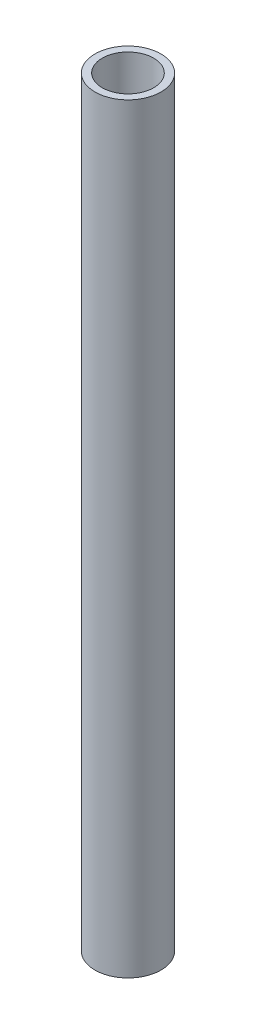
ISO-10303-21;
HEADER;
FILE_DESCRIPTION(('STEP AP214'),'2;1');
FILE_NAME('part.step','',(''),(''),'','','');
FILE_SCHEMA(('AUTOMOTIVE_DESIGN { 1 0 10303 214 1 1 1 1 }'));
ENDSEC;
DATA;
#1=APPLICATION_CONTEXT('core data for automotive mechanical design processes');
#2=APPLICATION_PROTOCOL_DEFINITION('international standard','automotive_design',2000,#1);
#3=PRODUCT_CONTEXT('',#1,'mechanical');
#4=PRODUCT('Part','Part','',(#3));
#5=PRODUCT_RELATED_PRODUCT_CATEGORY('part','',(#4));
#6=PRODUCT_DEFINITION_FORMATION('','',#4);
#7=PRODUCT_DEFINITION_CONTEXT('part definition',#1,'design');
#8=PRODUCT_DEFINITION('design','',#6,#7);
#9=PRODUCT_DEFINITION_SHAPE('','',#8);
#10=(LENGTH_UNIT() NAMED_UNIT(*) SI_UNIT(.MILLI.,.METRE.));
#11=(NAMED_UNIT(*) PLANE_ANGLE_UNIT() SI_UNIT($,.RADIAN.));
#12=(NAMED_UNIT(*) SI_UNIT($,.STERADIAN.) SOLID_ANGLE_UNIT());
#13=UNCERTAINTY_MEASURE_WITH_UNIT(LENGTH_MEASURE(1.E-05),#10,'distance_accuracy_value','');
#14=(GEOMETRIC_REPRESENTATION_CONTEXT(3) GLOBAL_UNCERTAINTY_ASSIGNED_CONTEXT((#13)) GLOBAL_UNIT_ASSIGNED_CONTEXT((#10,
#11,#12)) REPRESENTATION_CONTEXT('',''));
#15=CARTESIAN_POINT('',(0.,0.,0.));
#16=DIRECTION('',(0.,0.,1.));
#17=DIRECTION('',(1.,0.,0.));
#18=AXIS2_PLACEMENT_3D('',#15,#16,#17);
#19=CARTESIAN_POINT('',(0.,250.,0.));
#20=DIRECTION('',(0.,1.,0.));
#21=DIRECTION('',(0.,0.,0.999999999999999));
#22=AXIS2_PLACEMENT_3D('',#19,#20,#21);
#23=PLANE('',#22);
#24=CARTESIAN_POINT('',(0.,250.,0.));
#25=DIRECTION('',(0.,1.,0.));
#26=DIRECTION('',(0.,0.,0.999999999999999));
#27=AXIS2_PLACEMENT_3D('',#24,#25,#26);
#28=CIRCLE('',#27,10.85);
#29=CARTESIAN_POINT('',(0.,250.,10.85));
#30=VERTEX_POINT('',#29);
#31=EDGE_CURVE('E12',#30,#30,#28,.T.);
#32=ORIENTED_EDGE('',*,*,#31,.T.);
#33=EDGE_LOOP('',(#32));
#34=FACE_BOUND('',#33,.T.);
#35=CARTESIAN_POINT('',(0.,250.,0.));
#36=DIRECTION('',(0.,1.,0.));
#37=DIRECTION('',(0.,0.,0.999999999999999));
#38=AXIS2_PLACEMENT_3D('',#35,#36,#37);
#39=CIRCLE('',#38,8.45);
#40=CARTESIAN_POINT('',(0.,250.,8.44999999999999));
#41=VERTEX_POINT('',#40);
#42=EDGE_CURVE('E56',#41,#41,#39,.T.);
#43=ORIENTED_EDGE('',*,*,#42,.F.);
#44=EDGE_LOOP('',(#43));
#45=FACE_BOUND('',#44,.T.);
#46=ADVANCED_FACE('F42',(#34,#45),#23,.T.);
#47=CARTESIAN_POINT('',(0.,0.,0.));
#48=DIRECTION('',(0.,1.,0.));
#49=DIRECTION('',(0.,0.,0.999999999999999));
#50=AXIS2_PLACEMENT_3D('',#47,#48,#49);
#51=PLANE('',#50);
#52=CARTESIAN_POINT('',(0.,0.,0.));
#53=DIRECTION('',(0.,1.,0.));
#54=DIRECTION('',(0.,0.,0.999999999999999));
#55=AXIS2_PLACEMENT_3D('',#52,#53,#54);
#56=CIRCLE('',#55,10.85);
#57=CARTESIAN_POINT('',(0.,0.,10.85));
#58=VERTEX_POINT('',#57);
#59=EDGE_CURVE('E46',#58,#58,#56,.T.);
#60=ORIENTED_EDGE('',*,*,#59,.F.);
#61=EDGE_LOOP('',(#60));
#62=FACE_BOUND('',#61,.T.);
#63=CARTESIAN_POINT('',(0.,0.,0.));
#64=DIRECTION('',(0.,1.,0.));
#65=DIRECTION('',(0.,0.,0.999999999999999));
#66=AXIS2_PLACEMENT_3D('',#63,#64,#65);
#67=CIRCLE('',#66,8.45);
#68=CARTESIAN_POINT('',(0.,0.,8.44999999999999));
#69=VERTEX_POINT('',#68);
#70=EDGE_CURVE('E58',#69,#69,#67,.T.);
#71=ORIENTED_EDGE('',*,*,#70,.T.);
#72=EDGE_LOOP('',(#71));
#73=FACE_BOUND('',#72,.T.);
#74=ADVANCED_FACE('F71',(#62,#73),#51,.F.);
#75=CARTESIAN_POINT('',(0.,250.,0.));
#76=DIRECTION('',(0.,-1.,0.));
#77=DIRECTION('',(0.,0.,-0.999999999999999));
#78=AXIS2_PLACEMENT_3D('',#75,#76,#77);
#79=CYLINDRICAL_SURFACE('',#78,10.85);
#80=ORIENTED_EDGE('',*,*,#31,.F.);
#81=EDGE_LOOP('',(#80));
#82=FACE_BOUND('',#81,.T.);
#83=ORIENTED_EDGE('',*,*,#59,.T.);
#84=EDGE_LOOP('',(#83));
#85=FACE_BOUND('',#84,.T.);
#86=ADVANCED_FACE('F44',(#82,#85),#79,.T.);
#87=CARTESIAN_POINT('',(0.,250.,0.));
#88=DIRECTION('',(0.,-1.,0.));
#89=DIRECTION('',(0.,0.,-0.999999999999999));
#90=AXIS2_PLACEMENT_3D('',#87,#88,#89);
#91=CYLINDRICAL_SURFACE('',#90,8.45);
#92=ORIENTED_EDGE('',*,*,#42,.T.);
#93=EDGE_LOOP('',(#92));
#94=FACE_BOUND('',#93,.T.);
#95=ORIENTED_EDGE('',*,*,#70,.F.);
#96=EDGE_LOOP('',(#95));
#97=FACE_BOUND('',#96,.T.);
#98=ADVANCED_FACE('F67',(#94,#97),#91,.F.);
#99=CLOSED_SHELL('',(#46,#74,#86,#98));
#100=MANIFOLD_SOLID_BREP('B2',#99);
#101=ADVANCED_BREP_SHAPE_REPRESENTATION('',(#18,#100),#14);
#102=SHAPE_DEFINITION_REPRESENTATION(#9,#101);
ENDSEC;
END-ISO-10303-21;
